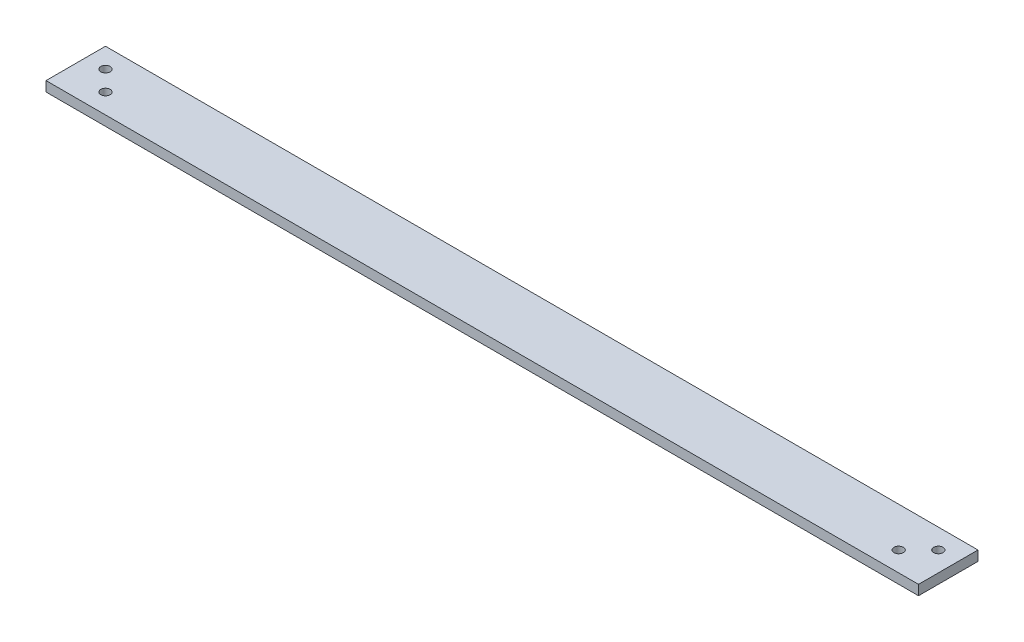
ISO-10303-21;
HEADER;
FILE_DESCRIPTION(('STEP AP214'),'2;1');
FILE_NAME('part.step','',(''),(''),'','','');
FILE_SCHEMA(('AUTOMOTIVE_DESIGN { 1 0 10303 214 1 1 1 1 }'));
ENDSEC;
DATA;
#1=APPLICATION_CONTEXT('core data for automotive mechanical design processes');
#2=APPLICATION_PROTOCOL_DEFINITION('international standard','automotive_design',2000,#1);
#3=PRODUCT_CONTEXT('',#1,'mechanical');
#4=PRODUCT('Part','Part','',(#3));
#5=PRODUCT_RELATED_PRODUCT_CATEGORY('part','',(#4));
#6=PRODUCT_DEFINITION_FORMATION('','',#4);
#7=PRODUCT_DEFINITION_CONTEXT('part definition',#1,'design');
#8=PRODUCT_DEFINITION('design','',#6,#7);
#9=PRODUCT_DEFINITION_SHAPE('','',#8);
#10=(LENGTH_UNIT() NAMED_UNIT(*) SI_UNIT(.MILLI.,.METRE.));
#11=(NAMED_UNIT(*) PLANE_ANGLE_UNIT() SI_UNIT($,.RADIAN.));
#12=(NAMED_UNIT(*) SI_UNIT($,.STERADIAN.) SOLID_ANGLE_UNIT());
#13=UNCERTAINTY_MEASURE_WITH_UNIT(LENGTH_MEASURE(1.E-05),#10,'distance_accuracy_value','');
#14=(GEOMETRIC_REPRESENTATION_CONTEXT(3) GLOBAL_UNCERTAINTY_ASSIGNED_CONTEXT((#13)) GLOBAL_UNIT_ASSIGNED_CONTEXT((#10,
#11,#12)) REPRESENTATION_CONTEXT('',''));
#15=CARTESIAN_POINT('',(0.,0.,0.));
#16=DIRECTION('',(0.,0.,1.));
#17=DIRECTION('',(1.,0.,0.));
#18=AXIS2_PLACEMENT_3D('',#15,#16,#17);
#19=CARTESIAN_POINT('',(139.7,3.175,9.52499999999998));
#20=DIRECTION('',(-1.,0.,0.));
#21=DIRECTION('',(0.,0.,1.));
#22=AXIS2_PLACEMENT_3D('',#19,#20,#21);
#23=PLANE('',#22);
#24=DIRECTION('',(0.,0.,-1.));
#25=VECTOR('',#24,1.);
#26=CARTESIAN_POINT('',(139.7,0.,9.52499999999998));
#27=LINE('',#26,#25);
#28=CARTESIAN_POINT('',(139.7,0.,9.52499999999998));
#29=VERTEX_POINT('',#28);
#30=CARTESIAN_POINT('',(139.7,0.,-9.52500000000002));
#31=VERTEX_POINT('',#30);
#32=EDGE_CURVE('E107',#29,#31,#27,.T.);
#33=ORIENTED_EDGE('',*,*,#32,.T.);
#34=DIRECTION('',(0.,-1.,0.));
#35=VECTOR('',#34,1.);
#36=CARTESIAN_POINT('',(139.7,3.175,-9.52500000000002));
#37=LINE('',#36,#35);
#38=CARTESIAN_POINT('',(139.7,3.175,-9.52500000000002));
#39=VERTEX_POINT('',#38);
#40=EDGE_CURVE('E11',#39,#31,#37,.T.);
#41=ORIENTED_EDGE('',*,*,#40,.F.);
#42=DIRECTION('',(0.,0.,-1.));
#43=VECTOR('',#42,1.);
#44=CARTESIAN_POINT('',(139.7,3.175,9.52499999999998));
#45=LINE('',#44,#43);
#46=CARTESIAN_POINT('',(139.7,3.175,9.52499999999998));
#47=VERTEX_POINT('',#46);
#48=EDGE_CURVE('E89',#47,#39,#45,.T.);
#49=ORIENTED_EDGE('',*,*,#48,.F.);
#50=DIRECTION('',(0.,-1.,0.));
#51=VECTOR('',#50,1.);
#52=CARTESIAN_POINT('',(139.7,3.175,9.52499999999998));
#53=LINE('',#52,#51);
#54=EDGE_CURVE('E56',#47,#29,#53,.T.);
#55=ORIENTED_EDGE('',*,*,#54,.T.);
#56=EDGE_LOOP('',(#33,#41,#49,#55));
#57=FACE_BOUND('',#56,.T.);
#58=ADVANCED_FACE('F39',(#57),#23,.F.);
#59=CARTESIAN_POINT('',(139.7,3.175,-9.52500000000002));
#60=DIRECTION('',(0.,0.,1.));
#61=DIRECTION('',(1.,0.,0.));
#62=AXIS2_PLACEMENT_3D('',#59,#60,#61);
#63=PLANE('',#62);
#64=DIRECTION('',(-1.,0.,0.));
#65=VECTOR('',#64,1.);
#66=CARTESIAN_POINT('',(139.7,0.,-9.52500000000002));
#67=LINE('',#66,#65);
#68=CARTESIAN_POINT('',(-139.7,0.,-9.52499999999998));
#69=VERTEX_POINT('',#68);
#70=EDGE_CURVE('E95',#31,#69,#67,.T.);
#71=ORIENTED_EDGE('',*,*,#70,.T.);
#72=DIRECTION('',(0.,-1.,0.));
#73=VECTOR('',#72,1.);
#74=CARTESIAN_POINT('',(-139.7,3.175,-9.52499999999998));
#75=LINE('',#74,#73);
#76=CARTESIAN_POINT('',(-139.7,3.175,-9.52499999999998));
#77=VERTEX_POINT('',#76);
#78=EDGE_CURVE('E48',#77,#69,#75,.T.);
#79=ORIENTED_EDGE('',*,*,#78,.F.);
#80=DIRECTION('',(-1.,0.,0.));
#81=VECTOR('',#80,1.);
#82=CARTESIAN_POINT('',(139.7,3.175,-9.52500000000002));
#83=LINE('',#82,#81);
#84=EDGE_CURVE('E81',#39,#77,#83,.T.);
#85=ORIENTED_EDGE('',*,*,#84,.F.);
#86=ORIENTED_EDGE('',*,*,#40,.T.);
#87=EDGE_LOOP('',(#71,#79,#85,#86));
#88=FACE_BOUND('',#87,.T.);
#89=ADVANCED_FACE('F94',(#88),#63,.F.);
#90=CARTESIAN_POINT('',(-139.7,3.175,9.52500000000002));
#91=DIRECTION('',(-1.,0.,0.));
#92=DIRECTION('',(0.,0.,1.));
#93=AXIS2_PLACEMENT_3D('',#90,#91,#92);
#94=PLANE('',#93);
#95=DIRECTION('',(0.,0.,-1.));
#96=VECTOR('',#95,1.);
#97=CARTESIAN_POINT('',(-139.7,0.,9.52500000000002));
#98=LINE('',#97,#96);
#99=CARTESIAN_POINT('',(-139.7,0.,9.52500000000002));
#100=VERTEX_POINT('',#99);
#101=EDGE_CURVE('E113',#100,#69,#98,.T.);
#102=ORIENTED_EDGE('',*,*,#101,.F.);
#103=DIRECTION('',(0.,-1.,0.));
#104=VECTOR('',#103,1.);
#105=CARTESIAN_POINT('',(-139.7,3.175,9.52500000000002));
#106=LINE('',#105,#104);
#107=CARTESIAN_POINT('',(-139.7,3.175,9.52500000000002));
#108=VERTEX_POINT('',#107);
#109=EDGE_CURVE('E70',#108,#100,#106,.T.);
#110=ORIENTED_EDGE('',*,*,#109,.F.);
#111=DIRECTION('',(0.,0.,-1.));
#112=VECTOR('',#111,1.);
#113=CARTESIAN_POINT('',(-139.7,3.175,9.52500000000002));
#114=LINE('',#113,#112);
#115=EDGE_CURVE('E88',#108,#77,#114,.T.);
#116=ORIENTED_EDGE('',*,*,#115,.T.);
#117=ORIENTED_EDGE('',*,*,#78,.T.);
#118=EDGE_LOOP('',(#102,#110,#116,#117));
#119=FACE_BOUND('',#118,.T.);
#120=ADVANCED_FACE('F99',(#119),#94,.T.);
#121=CARTESIAN_POINT('',(139.7,3.175,9.52499999999998));
#122=DIRECTION('',(0.,0.,1.));
#123=DIRECTION('',(1.,0.,0.));
#124=AXIS2_PLACEMENT_3D('',#121,#122,#123);
#125=PLANE('',#124);
#126=DIRECTION('',(-1.,0.,0.));
#127=VECTOR('',#126,1.);
#128=CARTESIAN_POINT('',(139.7,0.,9.52499999999998));
#129=LINE('',#128,#127);
#130=EDGE_CURVE('E116',#29,#100,#129,.T.);
#131=ORIENTED_EDGE('',*,*,#130,.F.);
#132=ORIENTED_EDGE('',*,*,#54,.F.);
#133=DIRECTION('',(-1.,0.,0.));
#134=VECTOR('',#133,1.);
#135=CARTESIAN_POINT('',(139.7,3.175,9.52499999999998));
#136=LINE('',#135,#134);
#137=EDGE_CURVE('E101',#47,#108,#136,.T.);
#138=ORIENTED_EDGE('',*,*,#137,.T.);
#139=ORIENTED_EDGE('',*,*,#109,.T.);
#140=EDGE_LOOP('',(#131,#132,#138,#139));
#141=FACE_BOUND('',#140,.T.);
#142=ADVANCED_FACE('F171',(#141),#125,.T.);
#143=CARTESIAN_POINT('',(0.,3.175,0.));
#144=DIRECTION('',(0.,1.,0.));
#145=DIRECTION('',(0.,0.,1.));
#146=AXIS2_PLACEMENT_3D('',#143,#144,#145);
#147=PLANE('',#146);
#148=CARTESIAN_POINT('',(133.35,3.175,-3.17499999999999));
#149=DIRECTION('',(0.,-1.,0.));
#150=DIRECTION('',(0.,0.,1.));
#151=AXIS2_PLACEMENT_3D('',#148,#149,#150);
#152=CIRCLE('',#151,1.5);
#153=CARTESIAN_POINT('',(133.35,3.175,-1.675));
#154=VERTEX_POINT('',#153);
#155=EDGE_CURVE('E150',#154,#154,#152,.T.);
#156=ORIENTED_EDGE('',*,*,#155,.T.);
#157=EDGE_LOOP('',(#156));
#158=FACE_BOUND('',#157,.T.);
#159=CARTESIAN_POINT('',(127.,3.175,3.17499999999999));
#160=DIRECTION('',(0.,-1.,0.));
#161=DIRECTION('',(0.,0.,1.));
#162=AXIS2_PLACEMENT_3D('',#159,#160,#161);
#163=CIRCLE('',#162,1.5);
#164=CARTESIAN_POINT('',(127.,3.175,4.67499999999999));
#165=VERTEX_POINT('',#164);
#166=EDGE_CURVE('E142',#165,#165,#163,.T.);
#167=ORIENTED_EDGE('',*,*,#166,.T.);
#168=EDGE_LOOP('',(#167));
#169=FACE_BOUND('',#168,.T.);
#170=CARTESIAN_POINT('',(-133.35,3.175,-3.17499999999999));
#171=DIRECTION('',(0.,1.,0.));
#172=DIRECTION('',(0.,0.,1.));
#173=AXIS2_PLACEMENT_3D('',#170,#171,#172);
#174=CIRCLE('',#173,1.5);
#175=CARTESIAN_POINT('',(-133.35,3.175,-1.675));
#176=VERTEX_POINT('',#175);
#177=EDGE_CURVE('E135',#176,#176,#174,.T.);
#178=ORIENTED_EDGE('',*,*,#177,.F.);
#179=EDGE_LOOP('',(#178));
#180=FACE_BOUND('',#179,.T.);
#181=CARTESIAN_POINT('',(-127.,3.175,3.17499999999999));
#182=DIRECTION('',(0.,1.,0.));
#183=DIRECTION('',(0.,0.,1.));
#184=AXIS2_PLACEMENT_3D('',#181,#182,#183);
#185=CIRCLE('',#184,1.5);
#186=CARTESIAN_POINT('',(-127.,3.175,4.67499999999999));
#187=VERTEX_POINT('',#186);
#188=EDGE_CURVE('E126',#187,#187,#185,.T.);
#189=ORIENTED_EDGE('',*,*,#188,.F.);
#190=EDGE_LOOP('',(#189));
#191=FACE_BOUND('',#190,.T.);
#192=ORIENTED_EDGE('',*,*,#48,.T.);
#193=ORIENTED_EDGE('',*,*,#84,.T.);
#194=ORIENTED_EDGE('',*,*,#115,.F.);
#195=ORIENTED_EDGE('',*,*,#137,.F.);
#196=EDGE_LOOP('',(#192,#193,#194,#195));
#197=FACE_BOUND('',#196,.T.);
#198=ADVANCED_FACE('F85',(#158,#169,#180,#191,#197),#147,.T.);
#199=CARTESIAN_POINT('',(0.,0.,0.));
#200=DIRECTION('',(0.,1.,0.));
#201=DIRECTION('',(0.,0.,1.));
#202=AXIS2_PLACEMENT_3D('',#199,#200,#201);
#203=PLANE('',#202);
#204=CARTESIAN_POINT('',(133.35,0.,-3.17499999999999));
#205=DIRECTION('',(0.,-1.,0.));
#206=DIRECTION('',(0.,0.,1.));
#207=AXIS2_PLACEMENT_3D('',#204,#205,#206);
#208=CIRCLE('',#207,1.5);
#209=CARTESIAN_POINT('',(133.35,0.,-1.675));
#210=VERTEX_POINT('',#209);
#211=EDGE_CURVE('E131',#210,#210,#208,.T.);
#212=ORIENTED_EDGE('',*,*,#211,.F.);
#213=EDGE_LOOP('',(#212));
#214=FACE_BOUND('',#213,.T.);
#215=CARTESIAN_POINT('',(127.,0.,3.17499999999999));
#216=DIRECTION('',(0.,-1.,0.));
#217=DIRECTION('',(0.,0.,1.));
#218=AXIS2_PLACEMENT_3D('',#215,#216,#217);
#219=CIRCLE('',#218,1.5);
#220=CARTESIAN_POINT('',(127.,0.,4.67499999999999));
#221=VERTEX_POINT('',#220);
#222=EDGE_CURVE('E146',#221,#221,#219,.T.);
#223=ORIENTED_EDGE('',*,*,#222,.F.);
#224=EDGE_LOOP('',(#223));
#225=FACE_BOUND('',#224,.T.);
#226=CARTESIAN_POINT('',(-133.35,0.,-3.17499999999999));
#227=DIRECTION('',(0.,1.,0.));
#228=DIRECTION('',(0.,0.,1.));
#229=AXIS2_PLACEMENT_3D('',#226,#227,#228);
#230=CIRCLE('',#229,1.5);
#231=CARTESIAN_POINT('',(-133.35,0.,-1.675));
#232=VERTEX_POINT('',#231);
#233=EDGE_CURVE('E110',#232,#232,#230,.T.);
#234=ORIENTED_EDGE('',*,*,#233,.T.);
#235=EDGE_LOOP('',(#234));
#236=FACE_BOUND('',#235,.T.);
#237=CARTESIAN_POINT('',(-127.,0.,3.17499999999999));
#238=DIRECTION('',(0.,1.,0.));
#239=DIRECTION('',(0.,0.,1.));
#240=AXIS2_PLACEMENT_3D('',#237,#238,#239);
#241=CIRCLE('',#240,1.5);
#242=CARTESIAN_POINT('',(-127.,0.,4.67499999999999));
#243=VERTEX_POINT('',#242);
#244=EDGE_CURVE('E130',#243,#243,#241,.T.);
#245=ORIENTED_EDGE('',*,*,#244,.T.);
#246=EDGE_LOOP('',(#245));
#247=FACE_BOUND('',#246,.T.);
#248=ORIENTED_EDGE('',*,*,#32,.F.);
#249=ORIENTED_EDGE('',*,*,#130,.T.);
#250=ORIENTED_EDGE('',*,*,#101,.T.);
#251=ORIENTED_EDGE('',*,*,#70,.F.);
#252=EDGE_LOOP('',(#248,#249,#250,#251));
#253=FACE_BOUND('',#252,.T.);
#254=ADVANCED_FACE('F161',(#214,#225,#236,#247,#253),#203,.F.);
#255=CARTESIAN_POINT('',(-127.,0.,3.17499999999999));
#256=DIRECTION('',(0.,1.,0.));
#257=DIRECTION('',(0.,0.,1.));
#258=AXIS2_PLACEMENT_3D('',#255,#256,#257);
#259=CYLINDRICAL_SURFACE('',#258,1.5);
#260=ORIENTED_EDGE('',*,*,#244,.F.);
#261=EDGE_LOOP('',(#260));
#262=FACE_BOUND('',#261,.T.);
#263=ORIENTED_EDGE('',*,*,#188,.T.);
#264=EDGE_LOOP('',(#263));
#265=FACE_BOUND('',#264,.T.);
#266=ADVANCED_FACE('F164',(#262,#265),#259,.F.);
#267=CARTESIAN_POINT('',(-133.35,0.,-3.17499999999999));
#268=DIRECTION('',(0.,1.,0.));
#269=DIRECTION('',(0.,0.,1.));
#270=AXIS2_PLACEMENT_3D('',#267,#268,#269);
#271=CYLINDRICAL_SURFACE('',#270,1.5);
#272=ORIENTED_EDGE('',*,*,#233,.F.);
#273=EDGE_LOOP('',(#272));
#274=FACE_BOUND('',#273,.T.);
#275=ORIENTED_EDGE('',*,*,#177,.T.);
#276=EDGE_LOOP('',(#275));
#277=FACE_BOUND('',#276,.T.);
#278=ADVANCED_FACE('F205',(#274,#277),#271,.F.);
#279=CARTESIAN_POINT('',(127.,0.,3.17499999999999));
#280=DIRECTION('',(0.,1.,0.));
#281=DIRECTION('',(0.,0.,1.));
#282=AXIS2_PLACEMENT_3D('',#279,#280,#281);
#283=CYLINDRICAL_SURFACE('',#282,1.5);
#284=ORIENTED_EDGE('',*,*,#222,.T.);
#285=EDGE_LOOP('',(#284));
#286=FACE_BOUND('',#285,.T.);
#287=ORIENTED_EDGE('',*,*,#166,.F.);
#288=EDGE_LOOP('',(#287));
#289=FACE_BOUND('',#288,.T.);
#290=ADVANCED_FACE('F216',(#286,#289),#283,.F.);
#291=CARTESIAN_POINT('',(133.35,0.,-3.17499999999999));
#292=DIRECTION('',(0.,1.,0.));
#293=DIRECTION('',(0.,0.,1.));
#294=AXIS2_PLACEMENT_3D('',#291,#292,#293);
#295=CYLINDRICAL_SURFACE('',#294,1.5);
#296=ORIENTED_EDGE('',*,*,#211,.T.);
#297=EDGE_LOOP('',(#296));
#298=FACE_BOUND('',#297,.T.);
#299=ORIENTED_EDGE('',*,*,#155,.F.);
#300=EDGE_LOOP('',(#299));
#301=FACE_BOUND('',#300,.T.);
#302=ADVANCED_FACE('F158',(#298,#301),#295,.F.);
#303=CLOSED_SHELL('',(#58,#89,#120,#142,#198,#254,#266,#278,#290,#302));
#304=MANIFOLD_SOLID_BREP('B2',#303);
#305=ADVANCED_BREP_SHAPE_REPRESENTATION('',(#18,#304),#14);
#306=SHAPE_DEFINITION_REPRESENTATION(#9,#305);
ENDSEC;
END-ISO-10303-21;
